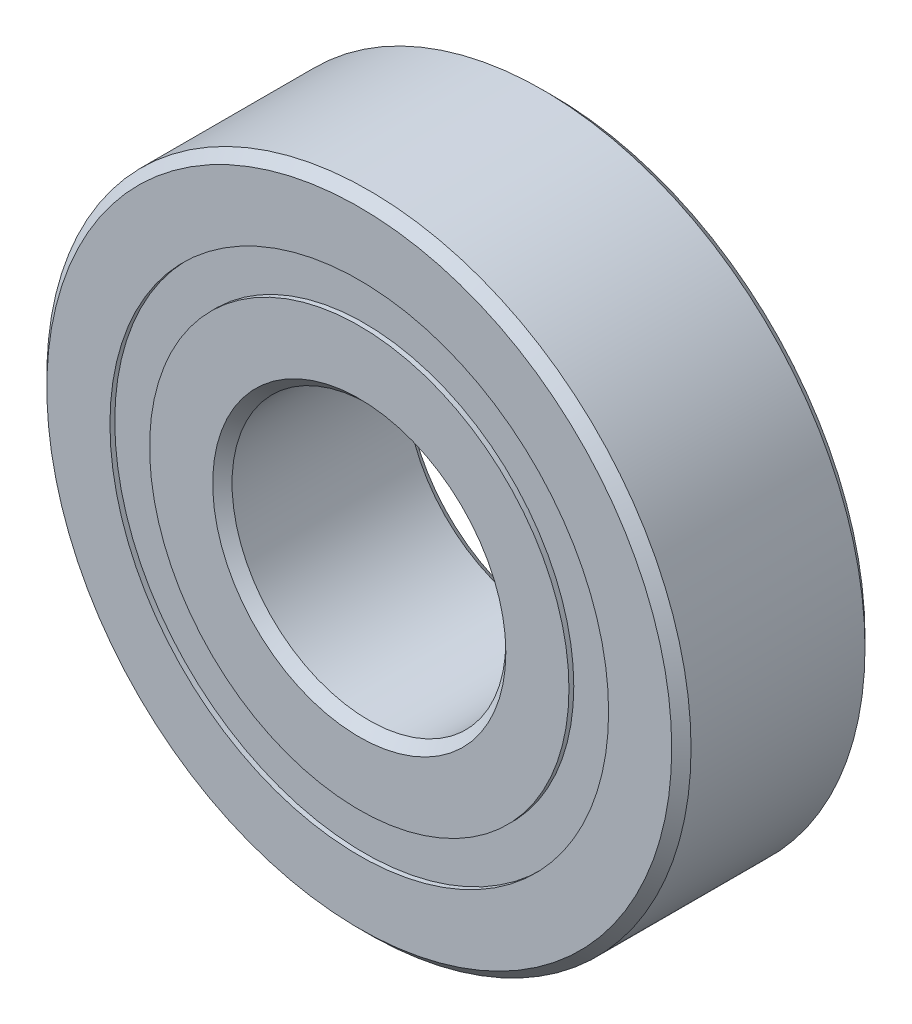
ISO-10303-21;
HEADER;
FILE_DESCRIPTION(('STEP AP214'),'2;1');
FILE_NAME('part.step','',(''),(''),'','','');
FILE_SCHEMA(('AUTOMOTIVE_DESIGN { 1 0 10303 214 1 1 1 1 }'));
ENDSEC;
DATA;
#1=APPLICATION_CONTEXT('core data for automotive mechanical design processes');
#2=APPLICATION_PROTOCOL_DEFINITION('international standard','automotive_design',2000,#1);
#3=PRODUCT_CONTEXT('',#1,'mechanical');
#4=PRODUCT('Part','Part','',(#3));
#5=PRODUCT_RELATED_PRODUCT_CATEGORY('part','',(#4));
#6=PRODUCT_DEFINITION_FORMATION('','',#4);
#7=PRODUCT_DEFINITION_CONTEXT('part definition',#1,'design');
#8=PRODUCT_DEFINITION('design','',#6,#7);
#9=PRODUCT_DEFINITION_SHAPE('','',#8);
#10=(LENGTH_UNIT() NAMED_UNIT(*) SI_UNIT(.MILLI.,.METRE.));
#11=(NAMED_UNIT(*) PLANE_ANGLE_UNIT() SI_UNIT($,.RADIAN.));
#12=(NAMED_UNIT(*) SI_UNIT($,.STERADIAN.) SOLID_ANGLE_UNIT());
#13=UNCERTAINTY_MEASURE_WITH_UNIT(LENGTH_MEASURE(1.E-05),#10,'distance_accuracy_value','');
#14=(GEOMETRIC_REPRESENTATION_CONTEXT(3) GLOBAL_UNCERTAINTY_ASSIGNED_CONTEXT((#13)) GLOBAL_UNIT_ASSIGNED_CONTEXT((#10,
#11,#12)) REPRESENTATION_CONTEXT('',''));
#15=CARTESIAN_POINT('',(0.,0.,0.));
#16=DIRECTION('',(0.,0.,1.));
#17=DIRECTION('',(1.,0.,0.));
#18=AXIS2_PLACEMENT_3D('',#15,#16,#17);
#19=CARTESIAN_POINT('',(0.,15.4807692307692,-5.7));
#20=DIRECTION('',(0.,0.,1.));
#21=DIRECTION('',(1.,0.,0.));
#22=AXIS2_PLACEMENT_3D('',#19,#20,#21);
#23=PLANE('',#22);
#24=CARTESIAN_POINT('',(0.,0.,-5.7));
#25=DIRECTION('',(0.,0.,1.));
#26=DIRECTION('',(1.,0.,0.));
#27=AXIS2_PLACEMENT_3D('',#24,#25,#26);
#28=CIRCLE('',#27,15.4807692307692);
#29=CARTESIAN_POINT('',(15.4807692307692,0.,-5.7));
#30=VERTEX_POINT('',#29);
#31=EDGE_CURVE('E60',#30,#30,#28,.T.);
#32=ORIENTED_EDGE('',*,*,#31,.F.);
#33=EDGE_LOOP('',(#32));
#34=FACE_BOUND('',#33,.T.);
#35=CARTESIAN_POINT('',(0.,0.,-5.7));
#36=DIRECTION('',(0.,0.,1.));
#37=DIRECTION('',(1.,0.,0.));
#38=AXIS2_PLACEMENT_3D('',#35,#36,#37);
#39=CIRCLE('',#38,13.0192307692308);
#40=CARTESIAN_POINT('',(13.0192307692308,0.,-5.7));
#41=VERTEX_POINT('',#40);
#42=EDGE_CURVE('E11',#41,#41,#39,.T.);
#43=ORIENTED_EDGE('',*,*,#42,.T.);
#44=EDGE_LOOP('',(#43));
#45=FACE_BOUND('',#44,.T.);
#46=ADVANCED_FACE('F46',(#34,#45),#23,.F.);
#47=CARTESIAN_POINT('',(0.,0.,6.));
#48=DIRECTION('',(0.,0.,1.));
#49=DIRECTION('',(1.,0.,0.));
#50=AXIS2_PLACEMENT_3D('',#47,#48,#49);
#51=CYLINDRICAL_SURFACE('',#50,13.0192307692308);
#52=ORIENTED_EDGE('',*,*,#42,.F.);
#53=EDGE_LOOP('',(#52));
#54=FACE_BOUND('',#53,.T.);
#55=CARTESIAN_POINT('',(0.,0.,-2.93698893605669));
#56=DIRECTION('',(0.,0.,1.));
#57=DIRECTION('',(1.,0.,0.));
#58=AXIS2_PLACEMENT_3D('',#55,#56,#57);
#59=CIRCLE('',#58,13.0192307692308);
#60=CARTESIAN_POINT('',(13.0192307692308,0.,-2.93698893605669));
#61=VERTEX_POINT('',#60);
#62=EDGE_CURVE('E52',#61,#61,#59,.T.);
#63=ORIENTED_EDGE('',*,*,#62,.T.);
#64=EDGE_LOOP('',(#63));
#65=FACE_BOUND('',#64,.T.);
#66=ADVANCED_FACE('F69',(#54,#65),#51,.F.);
#67=CARTESIAN_POINT('',(0.,15.4807692307692,-2.93698893605669));
#68=DIRECTION('',(0.,0.,-1.));
#69=DIRECTION('',(-1.,0.,0.));
#70=AXIS2_PLACEMENT_3D('',#67,#68,#69);
#71=PLANE('',#70);
#72=ORIENTED_EDGE('',*,*,#62,.F.);
#73=EDGE_LOOP('',(#72));
#74=FACE_BOUND('',#73,.T.);
#75=CARTESIAN_POINT('',(0.,0.,-2.93698893605669));
#76=DIRECTION('',(0.,0.,1.));
#77=DIRECTION('',(1.,0.,0.));
#78=AXIS2_PLACEMENT_3D('',#75,#76,#77);
#79=CIRCLE('',#78,15.4807692307692);
#80=CARTESIAN_POINT('',(15.4807692307692,0.,-2.93698893605669));
#81=VERTEX_POINT('',#80);
#82=EDGE_CURVE('E56',#81,#81,#79,.T.);
#83=ORIENTED_EDGE('',*,*,#82,.T.);
#84=EDGE_LOOP('',(#83));
#85=FACE_BOUND('',#84,.T.);
#86=ADVANCED_FACE('F73',(#74,#85),#71,.F.);
#87=CARTESIAN_POINT('',(0.,0.,6.));
#88=DIRECTION('',(0.,0.,1.));
#89=DIRECTION('',(1.,0.,0.));
#90=AXIS2_PLACEMENT_3D('',#87,#88,#89);
#91=CYLINDRICAL_SURFACE('',#90,15.4807692307692);
#92=ORIENTED_EDGE('',*,*,#82,.F.);
#93=EDGE_LOOP('',(#92));
#94=FACE_BOUND('',#93,.T.);
#95=ORIENTED_EDGE('',*,*,#31,.T.);
#96=EDGE_LOOP('',(#95));
#97=FACE_BOUND('',#96,.T.);
#98=ADVANCED_FACE('F66',(#94,#97),#91,.T.);
#99=CLOSED_SHELL('',(#46,#66,#86,#98));
#100=MANIFOLD_SOLID_BREP('B2',#99);
#101=CARTESIAN_POINT('',(0.,15.4807692307692,5.7));
#102=DIRECTION('',(0.,0.,-1.));
#103=DIRECTION('',(-1.,0.,0.));
#104=AXIS2_PLACEMENT_3D('',#101,#102,#103);
#105=PLANE('',#104);
#106=CARTESIAN_POINT('',(0.,0.,5.7));
#107=DIRECTION('',(0.,0.,1.));
#108=DIRECTION('',(1.,0.,0.));
#109=AXIS2_PLACEMENT_3D('',#106,#107,#108);
#110=CIRCLE('',#109,13.0192307692308);
#111=CARTESIAN_POINT('',(13.0192307692308,0.,5.7));
#112=VERTEX_POINT('',#111);
#113=EDGE_CURVE('E45',#112,#112,#110,.T.);
#114=ORIENTED_EDGE('',*,*,#113,.F.);
#115=EDGE_LOOP('',(#114));
#116=FACE_BOUND('',#115,.T.);
#117=CARTESIAN_POINT('',(0.,0.,5.7));
#118=DIRECTION('',(0.,0.,1.));
#119=DIRECTION('',(1.,0.,0.));
#120=AXIS2_PLACEMENT_3D('',#117,#118,#119);
#121=CIRCLE('',#120,15.4807692307692);
#122=CARTESIAN_POINT('',(15.4807692307692,0.,5.7));
#123=VERTEX_POINT('',#122);
#124=EDGE_CURVE('E128',#123,#123,#121,.T.);
#125=ORIENTED_EDGE('',*,*,#124,.T.);
#126=EDGE_LOOP('',(#125));
#127=FACE_BOUND('',#126,.T.);
#128=ADVANCED_FACE('F114',(#116,#127),#105,.F.);
#129=CARTESIAN_POINT('',(0.,0.,6.));
#130=DIRECTION('',(0.,0.,1.));
#131=DIRECTION('',(1.,0.,0.));
#132=AXIS2_PLACEMENT_3D('',#129,#130,#131);
#133=CYLINDRICAL_SURFACE('',#132,13.0192307692308);
#134=CARTESIAN_POINT('',(0.,0.,2.93698893605669));
#135=DIRECTION('',(0.,0.,1.));
#136=DIRECTION('',(1.,0.,0.));
#137=AXIS2_PLACEMENT_3D('',#134,#135,#136);
#138=CIRCLE('',#137,13.0192307692308);
#139=CARTESIAN_POINT('',(13.0192307692308,0.,2.93698893605669));
#140=VERTEX_POINT('',#139);
#141=EDGE_CURVE('E120',#140,#140,#138,.T.);
#142=ORIENTED_EDGE('',*,*,#141,.F.);
#143=EDGE_LOOP('',(#142));
#144=FACE_BOUND('',#143,.T.);
#145=ORIENTED_EDGE('',*,*,#113,.T.);
#146=EDGE_LOOP('',(#145));
#147=FACE_BOUND('',#146,.T.);
#148=ADVANCED_FACE('F143',(#144,#147),#133,.F.);
#149=CARTESIAN_POINT('',(0.,15.4807692307692,2.93698893605669));
#150=DIRECTION('',(0.,0.,1.));
#151=DIRECTION('',(1.,0.,0.));
#152=AXIS2_PLACEMENT_3D('',#149,#150,#151);
#153=PLANE('',#152);
#154=CARTESIAN_POINT('',(0.,0.,2.93698893605669));
#155=DIRECTION('',(0.,0.,1.));
#156=DIRECTION('',(1.,0.,0.));
#157=AXIS2_PLACEMENT_3D('',#154,#155,#156);
#158=CIRCLE('',#157,15.4807692307692);
#159=CARTESIAN_POINT('',(15.4807692307692,0.,2.93698893605669));
#160=VERTEX_POINT('',#159);
#161=EDGE_CURVE('E124',#160,#160,#158,.T.);
#162=ORIENTED_EDGE('',*,*,#161,.F.);
#163=EDGE_LOOP('',(#162));
#164=FACE_BOUND('',#163,.T.);
#165=ORIENTED_EDGE('',*,*,#141,.T.);
#166=EDGE_LOOP('',(#165));
#167=FACE_BOUND('',#166,.T.);
#168=ADVANCED_FACE('F138',(#164,#167),#153,.F.);
#169=CARTESIAN_POINT('',(0.,0.,6.));
#170=DIRECTION('',(0.,0.,1.));
#171=DIRECTION('',(1.,0.,0.));
#172=AXIS2_PLACEMENT_3D('',#169,#170,#171);
#173=CYLINDRICAL_SURFACE('',#172,15.4807692307692);
#174=ORIENTED_EDGE('',*,*,#124,.F.);
#175=EDGE_LOOP('',(#174));
#176=FACE_BOUND('',#175,.T.);
#177=ORIENTED_EDGE('',*,*,#161,.T.);
#178=EDGE_LOOP('',(#177));
#179=FACE_BOUND('',#178,.T.);
#180=ADVANCED_FACE('F135',(#176,#179),#173,.T.);
#181=CLOSED_SHELL('',(#128,#148,#168,#180));
#182=MANIFOLD_SOLID_BREP('B6',#181);
#183=CARTESIAN_POINT('',(-6.18284328242504,12.8388063676096,0.));
#184=DIRECTION('',(0.,0.,1.));
#185=DIRECTION('',(-0.433883739117546,0.900968867902425,0.));
#186=AXIS2_PLACEMENT_3D('',#183,#184,#185);
#187=SPHERICAL_SURFACE('',#186,2.93698893605669);
#188=CARTESIAN_POINT('',(-6.18284328242504,12.8388063676096,2.93698893605669));
#189=VERTEX_POINT('',#188);
#190=VERTEX_LOOP('',#189);
#191=FACE_BOUND('',#190,.T.);
#192=ADVANCED_FACE('F182',(#191),#187,.T.);
#193=CLOSED_SHELL('',(#192));
#194=MANIFOLD_SOLID_BREP('B40',#193);
#195=CARTESIAN_POINT('',(-11.1410986251693,8.88472967648709,0.));
#196=DIRECTION('',(0.,0.,1.));
#197=DIRECTION('',(-0.781831482468022,0.623489801858743,0.));
#198=AXIS2_PLACEMENT_3D('',#195,#196,#197);
#199=SPHERICAL_SURFACE('',#198,2.93698893605669);
#200=CARTESIAN_POINT('',(-11.1410986251693,8.88472967648709,2.93698893605669));
#201=VERTEX_POINT('',#200);
#202=VERTEX_LOOP('',#201);
#203=FACE_BOUND('',#202,.T.);
#204=ADVANCED_FACE('F203',(#203),#199,.T.);
#205=CLOSED_SHELL('',(#204));
#206=MANIFOLD_SOLID_BREP('B110',#205);
#207=CARTESIAN_POINT('',(-13.892722748591,3.17092330887763,0.));
#208=DIRECTION('',(0.,0.,1.));
#209=DIRECTION('',(-0.974927912181821,0.222520933956325,0.));
#210=AXIS2_PLACEMENT_3D('',#207,#208,#209);
#211=SPHERICAL_SURFACE('',#210,2.93698893605669);
#212=CARTESIAN_POINT('',(-13.892722748591,3.17092330887763,2.93698893605669));
#213=VERTEX_POINT('',#212);
#214=VERTEX_LOOP('',#213);
#215=FACE_BOUND('',#214,.T.);
#216=ADVANCED_FACE('F224',(#215),#211,.T.);
#217=CLOSED_SHELL('',(#216));
#218=MANIFOLD_SOLID_BREP('B178',#217);
#219=CARTESIAN_POINT('',(-13.892722748591,-3.17092330887735,0.));
#220=DIRECTION('',(0.,0.,1.));
#221=DIRECTION('',(-0.974927912181826,-0.222520933956305,0.));
#222=AXIS2_PLACEMENT_3D('',#219,#220,#221);
#223=SPHERICAL_SURFACE('',#222,2.93698893605669);
#224=CARTESIAN_POINT('',(-13.892722748591,-3.17092330887735,2.93698893605669));
#225=VERTEX_POINT('',#224);
#226=VERTEX_LOOP('',#225);
#227=FACE_BOUND('',#226,.T.);
#228=ADVANCED_FACE('F245',(#227),#223,.T.);
#229=CLOSED_SHELL('',(#228));
#230=MANIFOLD_SOLID_BREP('B199',#229);
#231=CARTESIAN_POINT('',(-11.1410986251695,-8.88472967648686,0.));
#232=DIRECTION('',(0.,0.,1.));
#233=DIRECTION('',(-0.781831482468035,-0.623489801858727,0.));
#234=AXIS2_PLACEMENT_3D('',#231,#232,#233);
#235=SPHERICAL_SURFACE('',#234,2.93698893605669);
#236=CARTESIAN_POINT('',(-11.1410986251695,-8.88472967648686,2.93698893605669));
#237=VERTEX_POINT('',#236);
#238=VERTEX_LOOP('',#237);
#239=FACE_BOUND('',#238,.T.);
#240=ADVANCED_FACE('F266',(#239),#235,.T.);
#241=CLOSED_SHELL('',(#240));
#242=MANIFOLD_SOLID_BREP('B220',#241);
#243=CARTESIAN_POINT('',(-6.1828432824253,-12.8388063676094,0.));
#244=DIRECTION('',(0.,0.,1.));
#245=DIRECTION('',(-0.433883739117565,-0.900968867902416,0.));
#246=AXIS2_PLACEMENT_3D('',#243,#244,#245);
#247=SPHERICAL_SURFACE('',#246,2.93698893605669);
#248=CARTESIAN_POINT('',(-6.1828432824253,-12.8388063676094,2.93698893605669));
#249=VERTEX_POINT('',#248);
#250=VERTEX_LOOP('',#249);
#251=FACE_BOUND('',#250,.T.);
#252=ADVANCED_FACE('F287',(#251),#247,.T.);
#253=CLOSED_SHELL('',(#252));
#254=MANIFOLD_SOLID_BREP('B241',#253);
#255=CARTESIAN_POINT('',(0.,-14.25,0.));
#256=DIRECTION('',(0.,0.,1.));
#257=DIRECTION('',(0.,-1.,0.));
#258=AXIS2_PLACEMENT_3D('',#255,#256,#257);
#259=SPHERICAL_SURFACE('',#258,2.93698893605669);
#260=CARTESIAN_POINT('',(0.,-14.25,2.93698893605669));
#261=VERTEX_POINT('',#260);
#262=VERTEX_LOOP('',#261);
#263=FACE_BOUND('',#262,.T.);
#264=ADVANCED_FACE('F308',(#263),#259,.T.);
#265=CLOSED_SHELL('',(#264));
#266=MANIFOLD_SOLID_BREP('B262',#265);
#267=CARTESIAN_POINT('',(6.18284328242513,-12.8388063676095,0.));
#268=DIRECTION('',(0.,0.,1.));
#269=DIRECTION('',(0.433883739117553,-0.900968867902422,0.));
#270=AXIS2_PLACEMENT_3D('',#267,#268,#269);
#271=SPHERICAL_SURFACE('',#270,2.93698893605669);
#272=CARTESIAN_POINT('',(6.18284328242513,-12.8388063676095,2.93698893605669));
#273=VERTEX_POINT('',#272);
#274=VERTEX_LOOP('',#273);
#275=FACE_BOUND('',#274,.T.);
#276=ADVANCED_FACE('F329',(#275),#271,.T.);
#277=CLOSED_SHELL('',(#276));
#278=MANIFOLD_SOLID_BREP('B283',#277);
#279=CARTESIAN_POINT('',(11.1410986251694,-8.88472967648701,0.));
#280=DIRECTION('',(0.,0.,1.));
#281=DIRECTION('',(0.781831482468027,-0.623489801858737,0.));
#282=AXIS2_PLACEMENT_3D('',#279,#280,#281);
#283=SPHERICAL_SURFACE('',#282,2.93698893605669);
#284=CARTESIAN_POINT('',(11.1410986251694,-8.88472967648701,2.93698893605669));
#285=VERTEX_POINT('',#284);
#286=VERTEX_LOOP('',#285);
#287=FACE_BOUND('',#286,.T.);
#288=ADVANCED_FACE('F350',(#287),#283,.T.);
#289=CLOSED_SHELL('',(#288));
#290=MANIFOLD_SOLID_BREP('B304',#289);
#291=CARTESIAN_POINT('',(13.892722748591,-3.17092330887753,0.));
#292=DIRECTION('',(0.,0.,1.));
#293=DIRECTION('',(0.974927912181823,-0.222520933956318,0.));
#294=AXIS2_PLACEMENT_3D('',#291,#292,#293);
#295=SPHERICAL_SURFACE('',#294,2.93698893605669);
#296=CARTESIAN_POINT('',(13.892722748591,-3.17092330887753,2.93698893605669));
#297=VERTEX_POINT('',#296);
#298=VERTEX_LOOP('',#297);
#299=FACE_BOUND('',#298,.T.);
#300=ADVANCED_FACE('F371',(#299),#295,.T.);
#301=CLOSED_SHELL('',(#300));
#302=MANIFOLD_SOLID_BREP('B325',#301);
#303=CARTESIAN_POINT('',(13.892722748591,3.17092330887744,0.));
#304=DIRECTION('',(0.,0.,1.));
#305=DIRECTION('',(0.974927912181824,0.222520933956311,0.));
#306=AXIS2_PLACEMENT_3D('',#303,#304,#305);
#307=SPHERICAL_SURFACE('',#306,2.93698893605669);
#308=CARTESIAN_POINT('',(13.892722748591,3.17092330887744,2.93698893605669));
#309=VERTEX_POINT('',#308);
#310=VERTEX_LOOP('',#309);
#311=FACE_BOUND('',#310,.T.);
#312=ADVANCED_FACE('F392',(#311),#307,.T.);
#313=CLOSED_SHELL('',(#312));
#314=MANIFOLD_SOLID_BREP('B346',#313);
#315=CARTESIAN_POINT('',(11.1410986251694,8.88472967648693,0.));
#316=DIRECTION('',(0.,0.,1.));
#317=DIRECTION('',(0.781831482468031,0.623489801858732,0.));
#318=AXIS2_PLACEMENT_3D('',#315,#316,#317);
#319=SPHERICAL_SURFACE('',#318,2.93698893605669);
#320=CARTESIAN_POINT('',(11.1410986251694,8.88472967648693,2.93698893605669));
#321=VERTEX_POINT('',#320);
#322=VERTEX_LOOP('',#321);
#323=FACE_BOUND('',#322,.T.);
#324=ADVANCED_FACE('F413',(#323),#319,.T.);
#325=CLOSED_SHELL('',(#324));
#326=MANIFOLD_SOLID_BREP('B367',#325);
#327=CARTESIAN_POINT('',(6.18284328242522,12.8388063676095,0.));
#328=DIRECTION('',(0.,0.,1.));
#329=DIRECTION('',(0.433883739117559,0.900968867902419,0.));
#330=AXIS2_PLACEMENT_3D('',#327,#328,#329);
#331=SPHERICAL_SURFACE('',#330,2.93698893605669);
#332=CARTESIAN_POINT('',(6.18284328242522,12.8388063676095,2.93698893605669));
#333=VERTEX_POINT('',#332);
#334=VERTEX_LOOP('',#333);
#335=FACE_BOUND('',#334,.T.);
#336=ADVANCED_FACE('F434',(#335),#331,.T.);
#337=CLOSED_SHELL('',(#336));
#338=MANIFOLD_SOLID_BREP('B388',#337);
#339=CARTESIAN_POINT('',(0.,14.25,0.));
#340=DIRECTION('',(0.,0.,1.));
#341=DIRECTION('',(0.,1.,0.));
#342=AXIS2_PLACEMENT_3D('',#339,#340,#341);
#343=SPHERICAL_SURFACE('',#342,2.93698893605669);
#344=CARTESIAN_POINT('',(0.,14.25,2.93698893605669));
#345=VERTEX_POINT('',#344);
#346=VERTEX_LOOP('',#345);
#347=FACE_BOUND('',#346,.T.);
#348=ADVANCED_FACE('F457',(#347),#343,.T.);
#349=CLOSED_SHELL('',(#348));
#350=MANIFOLD_SOLID_BREP('B409',#349);
#351=CARTESIAN_POINT('',(0.,13.0192307692308,6.));
#352=DIRECTION('',(0.,0.,-1.));
#353=DIRECTION('',(-1.,0.,0.));
#354=AXIS2_PLACEMENT_3D('',#351,#352,#353);
#355=PLANE('',#354);
#356=CARTESIAN_POINT('',(0.,0.,6.));
#357=DIRECTION('',(0.,0.,1.));
#358=DIRECTION('',(1.,0.,0.));
#359=AXIS2_PLACEMENT_3D('',#356,#357,#358);
#360=CIRCLE('',#359,9.1);
#361=CARTESIAN_POINT('',(9.1,0.,6.));
#362=VERTEX_POINT('',#361);
#363=EDGE_CURVE('E505',#362,#362,#360,.T.);
#364=ORIENTED_EDGE('',*,*,#363,.F.);
#365=EDGE_LOOP('',(#364));
#366=FACE_BOUND('',#365,.T.);
#367=CARTESIAN_POINT('',(0.,0.,6.));
#368=DIRECTION('',(0.,0.,1.));
#369=DIRECTION('',(1.,0.,0.));
#370=AXIS2_PLACEMENT_3D('',#367,#368,#369);
#371=CIRCLE('',#370,13.0192307692308);
#372=CARTESIAN_POINT('',(13.0192307692308,0.,6.));
#373=VERTEX_POINT('',#372);
#374=EDGE_CURVE('E456',#373,#373,#371,.T.);
#375=ORIENTED_EDGE('',*,*,#374,.T.);
#376=EDGE_LOOP('',(#375));
#377=FACE_BOUND('',#376,.T.);
#378=ADVANCED_FACE('F477',(#366,#377),#355,.F.);
#379=CARTESIAN_POINT('',(0.,0.,6.));
#380=DIRECTION('',(0.,0.,1.));
#381=DIRECTION('',(1.,0.,0.));
#382=AXIS2_PLACEMENT_3D('',#379,#380,#381);
#383=CYLINDRICAL_SURFACE('',#382,13.0192307692308);
#384=ORIENTED_EDGE('',*,*,#374,.F.);
#385=EDGE_LOOP('',(#384));
#386=FACE_BOUND('',#385,.T.);
#387=CARTESIAN_POINT('',(0.,0.,2.66666666666667));
#388=DIRECTION('',(0.,0.,1.));
#389=DIRECTION('',(1.,0.,0.));
#390=AXIS2_PLACEMENT_3D('',#387,#388,#389);
#391=CIRCLE('',#390,13.0192307692308);
#392=CARTESIAN_POINT('',(13.0192307692308,0.,2.66666666666667));
#393=VERTEX_POINT('',#392);
#394=EDGE_CURVE('E483',#393,#393,#391,.T.);
#395=ORIENTED_EDGE('',*,*,#394,.T.);
#396=EDGE_LOOP('',(#395));
#397=FACE_BOUND('',#396,.T.);
#398=ADVANCED_FACE('F512',(#386,#397),#383,.T.);
#399=CARTESIAN_POINT('',(0.,0.,0.));
#400=DIRECTION('',(0.,0.,1.));
#401=DIRECTION('',(1.,0.,0.));
#402=AXIS2_PLACEMENT_3D('',#399,#400,#401);
#403=TOROIDAL_SURFACE('',#402,14.25,2.93698893605668);
#404=ORIENTED_EDGE('',*,*,#394,.F.);
#405=EDGE_LOOP('',(#404));
#406=FACE_BOUND('',#405,.T.);
#407=CARTESIAN_POINT('',(0.,0.,-2.66666666666667));
#408=DIRECTION('',(0.,0.,1.));
#409=DIRECTION('',(1.,0.,0.));
#410=AXIS2_PLACEMENT_3D('',#407,#408,#409);
#411=CIRCLE('',#410,13.0192307692308);
#412=CARTESIAN_POINT('',(13.0192307692308,0.,-2.66666666666667));
#413=VERTEX_POINT('',#412);
#414=EDGE_CURVE('E487',#413,#413,#411,.T.);
#415=ORIENTED_EDGE('',*,*,#414,.T.);
#416=EDGE_LOOP('',(#415));
#417=FACE_BOUND('',#416,.T.);
#418=ADVANCED_FACE('F516',(#406,#417),#403,.F.);
#419=CARTESIAN_POINT('',(0.,0.,6.));
#420=DIRECTION('',(0.,0.,1.));
#421=DIRECTION('',(1.,0.,0.));
#422=AXIS2_PLACEMENT_3D('',#419,#420,#421);
#423=CYLINDRICAL_SURFACE('',#422,13.0192307692308);
#424=ORIENTED_EDGE('',*,*,#414,.F.);
#425=EDGE_LOOP('',(#424));
#426=FACE_BOUND('',#425,.T.);
#427=CARTESIAN_POINT('',(0.,0.,-6.));
#428=DIRECTION('',(0.,0.,1.));
#429=DIRECTION('',(1.,0.,0.));
#430=AXIS2_PLACEMENT_3D('',#427,#428,#429);
#431=CIRCLE('',#430,13.0192307692308);
#432=CARTESIAN_POINT('',(13.0192307692308,0.,-6.));
#433=VERTEX_POINT('',#432);
#434=EDGE_CURVE('E491',#433,#433,#431,.T.);
#435=ORIENTED_EDGE('',*,*,#434,.T.);
#436=EDGE_LOOP('',(#435));
#437=FACE_BOUND('',#436,.T.);
#438=ADVANCED_FACE('F521',(#426,#437),#423,.T.);
#439=CARTESIAN_POINT('',(0.,9.1,-6.));
#440=DIRECTION('',(0.,0.,1.));
#441=DIRECTION('',(1.,0.,0.));
#442=AXIS2_PLACEMENT_3D('',#439,#440,#441);
#443=PLANE('',#442);
#444=ORIENTED_EDGE('',*,*,#434,.F.);
#445=EDGE_LOOP('',(#444));
#446=FACE_BOUND('',#445,.T.);
#447=CARTESIAN_POINT('',(0.,0.,-6.));
#448=DIRECTION('',(0.,0.,1.));
#449=DIRECTION('',(1.,0.,0.));
#450=AXIS2_PLACEMENT_3D('',#447,#448,#449);
#451=CIRCLE('',#450,9.1);
#452=CARTESIAN_POINT('',(9.1,0.,-6.));
#453=VERTEX_POINT('',#452);
#454=EDGE_CURVE('E496',#453,#453,#451,.T.);
#455=ORIENTED_EDGE('',*,*,#454,.T.);
#456=EDGE_LOOP('',(#455));
#457=FACE_BOUND('',#456,.T.);
#458=ADVANCED_FACE('F527',(#446,#457),#443,.F.);
#459=CARTESIAN_POINT('',(0.,0.,-5.4));
#460=DIRECTION('',(0.,0.,-1.));
#461=DIRECTION('',(-1.,0.,0.));
#462=AXIS2_PLACEMENT_3D('',#459,#460,#461);
#463=CONICAL_SURFACE('',#462,8.5,0.785398163397445);
#464=ORIENTED_EDGE('',*,*,#454,.F.);
#465=EDGE_LOOP('',(#464));
#466=FACE_BOUND('',#465,.T.);
#467=CARTESIAN_POINT('',(0.,0.,-5.4));
#468=DIRECTION('',(0.,0.,1.));
#469=DIRECTION('',(1.,0.,0.));
#470=AXIS2_PLACEMENT_3D('',#467,#468,#469);
#471=CIRCLE('',#470,8.5);
#472=CARTESIAN_POINT('',(8.5,0.,-5.4));
#473=VERTEX_POINT('',#472);
#474=EDGE_CURVE('E499',#473,#473,#471,.T.);
#475=ORIENTED_EDGE('',*,*,#474,.T.);
#476=EDGE_LOOP('',(#475));
#477=FACE_BOUND('',#476,.T.);
#478=ADVANCED_FACE('F531',(#466,#477),#463,.F.);
#479=CARTESIAN_POINT('',(0.,0.,6.));
#480=DIRECTION('',(0.,0.,1.));
#481=DIRECTION('',(1.,0.,0.));
#482=AXIS2_PLACEMENT_3D('',#479,#480,#481);
#483=CYLINDRICAL_SURFACE('',#482,8.5);
#484=ORIENTED_EDGE('',*,*,#474,.F.);
#485=EDGE_LOOP('',(#484));
#486=FACE_BOUND('',#485,.T.);
#487=CARTESIAN_POINT('',(0.,0.,5.4));
#488=DIRECTION('',(0.,0.,1.));
#489=DIRECTION('',(1.,0.,0.));
#490=AXIS2_PLACEMENT_3D('',#487,#488,#489);
#491=CIRCLE('',#490,8.5);
#492=CARTESIAN_POINT('',(8.5,0.,5.4));
#493=VERTEX_POINT('',#492);
#494=EDGE_CURVE('E502',#493,#493,#491,.T.);
#495=ORIENTED_EDGE('',*,*,#494,.T.);
#496=EDGE_LOOP('',(#495));
#497=FACE_BOUND('',#496,.T.);
#498=ADVANCED_FACE('F535',(#486,#497),#483,.F.);
#499=CARTESIAN_POINT('',(0.,0.,6.));
#500=DIRECTION('',(0.,0.,1.));
#501=DIRECTION('',(1.,0.,0.));
#502=AXIS2_PLACEMENT_3D('',#499,#500,#501);
#503=CONICAL_SURFACE('',#502,9.1,0.78539816339745);
#504=ORIENTED_EDGE('',*,*,#494,.F.);
#505=EDGE_LOOP('',(#504));
#506=FACE_BOUND('',#505,.T.);
#507=ORIENTED_EDGE('',*,*,#363,.T.);
#508=EDGE_LOOP('',(#507));
#509=FACE_BOUND('',#508,.T.);
#510=ADVANCED_FACE('F509',(#506,#509),#503,.F.);
#511=CLOSED_SHELL('',(#378,#398,#418,#438,#458,#478,#498,#510));
#512=MANIFOLD_SOLID_BREP('B430',#511);
#513=CARTESIAN_POINT('',(0.,0.,5.4));
#514=DIRECTION('',(0.,0.,-1.));
#515=DIRECTION('',(-1.,0.,0.));
#516=AXIS2_PLACEMENT_3D('',#513,#514,#515);
#517=CONICAL_SURFACE('',#516,20.,0.785398163397445);
#518=CARTESIAN_POINT('',(0.,0.,6.));
#519=DIRECTION('',(0.,0.,1.));
#520=DIRECTION('',(1.,0.,0.));
#521=AXIS2_PLACEMENT_3D('',#518,#519,#520);
#522=CIRCLE('',#521,19.4);
#523=CARTESIAN_POINT('',(19.4,0.,6.));
#524=VERTEX_POINT('',#523);
#525=EDGE_CURVE('E627',#524,#524,#522,.T.);
#526=ORIENTED_EDGE('',*,*,#525,.F.);
#527=EDGE_LOOP('',(#526));
#528=FACE_BOUND('',#527,.T.);
#529=CARTESIAN_POINT('',(0.,0.,5.4));
#530=DIRECTION('',(0.,0.,1.));
#531=DIRECTION('',(1.,0.,0.));
#532=AXIS2_PLACEMENT_3D('',#529,#530,#531);
#533=CIRCLE('',#532,20.);
#534=CARTESIAN_POINT('',(20.,0.,5.4));
#535=VERTEX_POINT('',#534);
#536=EDGE_CURVE('E476',#535,#535,#533,.T.);
#537=ORIENTED_EDGE('',*,*,#536,.T.);
#538=EDGE_LOOP('',(#537));
#539=FACE_BOUND('',#538,.T.);
#540=ADVANCED_FACE('F599',(#528,#539),#517,.T.);
#541=CARTESIAN_POINT('',(0.,0.,6.));
#542=DIRECTION('',(0.,0.,1.));
#543=DIRECTION('',(1.,0.,0.));
#544=AXIS2_PLACEMENT_3D('',#541,#542,#543);
#545=CYLINDRICAL_SURFACE('',#544,20.);
#546=ORIENTED_EDGE('',*,*,#536,.F.);
#547=EDGE_LOOP('',(#546));
#548=FACE_BOUND('',#547,.T.);
#549=CARTESIAN_POINT('',(0.,0.,-5.4));
#550=DIRECTION('',(0.,0.,1.));
#551=DIRECTION('',(1.,0.,0.));
#552=AXIS2_PLACEMENT_3D('',#549,#550,#551);
#553=CIRCLE('',#552,20.);
#554=CARTESIAN_POINT('',(20.,0.,-5.4));
#555=VERTEX_POINT('',#554);
#556=EDGE_CURVE('E605',#555,#555,#553,.T.);
#557=ORIENTED_EDGE('',*,*,#556,.T.);
#558=EDGE_LOOP('',(#557));
#559=FACE_BOUND('',#558,.T.);
#560=ADVANCED_FACE('F634',(#548,#559),#545,.T.);
#561=CARTESIAN_POINT('',(0.,0.,-6.));
#562=DIRECTION('',(0.,0.,1.));
#563=DIRECTION('',(1.,0.,0.));
#564=AXIS2_PLACEMENT_3D('',#561,#562,#563);
#565=CONICAL_SURFACE('',#564,19.4,0.785398163397445);
#566=ORIENTED_EDGE('',*,*,#556,.F.);
#567=EDGE_LOOP('',(#566));
#568=FACE_BOUND('',#567,.T.);
#569=CARTESIAN_POINT('',(0.,0.,-6.));
#570=DIRECTION('',(0.,0.,1.));
#571=DIRECTION('',(1.,0.,0.));
#572=AXIS2_PLACEMENT_3D('',#569,#570,#571);
#573=CIRCLE('',#572,19.4);
#574=CARTESIAN_POINT('',(19.4,0.,-6.));
#575=VERTEX_POINT('',#574);
#576=EDGE_CURVE('E609',#575,#575,#573,.T.);
#577=ORIENTED_EDGE('',*,*,#576,.T.);
#578=EDGE_LOOP('',(#577));
#579=FACE_BOUND('',#578,.T.);
#580=ADVANCED_FACE('F638',(#568,#579),#565,.T.);
#581=CARTESIAN_POINT('',(0.,19.4,-6.));
#582=DIRECTION('',(0.,0.,1.));
#583=DIRECTION('',(1.,0.,0.));
#584=AXIS2_PLACEMENT_3D('',#581,#582,#583);
#585=PLANE('',#584);
#586=ORIENTED_EDGE('',*,*,#576,.F.);
#587=EDGE_LOOP('',(#586));
#588=FACE_BOUND('',#587,.T.);
#589=CARTESIAN_POINT('',(0.,0.,-6.));
#590=DIRECTION('',(0.,0.,1.));
#591=DIRECTION('',(1.,0.,0.));
#592=AXIS2_PLACEMENT_3D('',#589,#590,#591);
#593=CIRCLE('',#592,15.4807692307692);
#594=CARTESIAN_POINT('',(15.4807692307692,0.,-6.));
#595=VERTEX_POINT('',#594);
#596=EDGE_CURVE('E613',#595,#595,#593,.T.);
#597=ORIENTED_EDGE('',*,*,#596,.T.);
#598=EDGE_LOOP('',(#597));
#599=FACE_BOUND('',#598,.T.);
#600=ADVANCED_FACE('F643',(#588,#599),#585,.F.);
#601=CARTESIAN_POINT('',(0.,0.,6.));
#602=DIRECTION('',(0.,0.,1.));
#603=DIRECTION('',(1.,0.,0.));
#604=AXIS2_PLACEMENT_3D('',#601,#602,#603);
#605=CYLINDRICAL_SURFACE('',#604,15.4807692307692);
#606=ORIENTED_EDGE('',*,*,#596,.F.);
#607=EDGE_LOOP('',(#606));
#608=FACE_BOUND('',#607,.T.);
#609=CARTESIAN_POINT('',(0.,0.,-2.66666666666667));
#610=DIRECTION('',(0.,0.,1.));
#611=DIRECTION('',(1.,0.,0.));
#612=AXIS2_PLACEMENT_3D('',#609,#610,#611);
#613=CIRCLE('',#612,15.4807692307692);
#614=CARTESIAN_POINT('',(15.4807692307692,0.,-2.66666666666667));
#615=VERTEX_POINT('',#614);
#616=EDGE_CURVE('E618',#615,#615,#613,.T.);
#617=ORIENTED_EDGE('',*,*,#616,.T.);
#618=EDGE_LOOP('',(#617));
#619=FACE_BOUND('',#618,.T.);
#620=ADVANCED_FACE('F649',(#608,#619),#605,.F.);
#621=CARTESIAN_POINT('',(0.,0.,0.));
#622=DIRECTION('',(0.,0.,1.));
#623=DIRECTION('',(1.,0.,0.));
#624=AXIS2_PLACEMENT_3D('',#621,#622,#623);
#625=TOROIDAL_SURFACE('',#624,14.25,2.93698893605669);
#626=ORIENTED_EDGE('',*,*,#616,.F.);
#627=EDGE_LOOP('',(#626));
#628=FACE_BOUND('',#627,.T.);
#629=CARTESIAN_POINT('',(0.,0.,2.66666666666667));
#630=DIRECTION('',(0.,0.,1.));
#631=DIRECTION('',(1.,0.,0.));
#632=AXIS2_PLACEMENT_3D('',#629,#630,#631);
#633=CIRCLE('',#632,15.4807692307692);
#634=CARTESIAN_POINT('',(15.4807692307692,0.,2.66666666666667));
#635=VERTEX_POINT('',#634);
#636=EDGE_CURVE('E621',#635,#635,#633,.T.);
#637=ORIENTED_EDGE('',*,*,#636,.T.);
#638=EDGE_LOOP('',(#637));
#639=FACE_BOUND('',#638,.T.);
#640=ADVANCED_FACE('F653',(#628,#639),#625,.F.);
#641=CARTESIAN_POINT('',(0.,0.,6.));
#642=DIRECTION('',(0.,0.,1.));
#643=DIRECTION('',(1.,0.,0.));
#644=AXIS2_PLACEMENT_3D('',#641,#642,#643);
#645=CYLINDRICAL_SURFACE('',#644,15.4807692307692);
#646=ORIENTED_EDGE('',*,*,#636,.F.);
#647=EDGE_LOOP('',(#646));
#648=FACE_BOUND('',#647,.T.);
#649=CARTESIAN_POINT('',(0.,0.,6.));
#650=DIRECTION('',(0.,0.,1.));
#651=DIRECTION('',(1.,0.,0.));
#652=AXIS2_PLACEMENT_3D('',#649,#650,#651);
#653=CIRCLE('',#652,15.4807692307692);
#654=CARTESIAN_POINT('',(15.4807692307692,0.,6.));
#655=VERTEX_POINT('',#654);
#656=EDGE_CURVE('E624',#655,#655,#653,.T.);
#657=ORIENTED_EDGE('',*,*,#656,.T.);
#658=EDGE_LOOP('',(#657));
#659=FACE_BOUND('',#658,.T.);
#660=ADVANCED_FACE('F657',(#648,#659),#645,.F.);
#661=CARTESIAN_POINT('',(0.,19.4,6.));
#662=DIRECTION('',(0.,0.,-1.));
#663=DIRECTION('',(-1.,0.,0.));
#664=AXIS2_PLACEMENT_3D('',#661,#662,#663);
#665=PLANE('',#664);
#666=ORIENTED_EDGE('',*,*,#656,.F.);
#667=EDGE_LOOP('',(#666));
#668=FACE_BOUND('',#667,.T.);
#669=ORIENTED_EDGE('',*,*,#525,.T.);
#670=EDGE_LOOP('',(#669));
#671=FACE_BOUND('',#670,.T.);
#672=ADVANCED_FACE('F631',(#668,#671),#665,.F.);
#673=CLOSED_SHELL('',(#540,#560,#580,#600,#620,#640,#660,#672));
#674=MANIFOLD_SOLID_BREP('B451',#673);
#675=ADVANCED_BREP_SHAPE_REPRESENTATION('',(#18,#100,#182,#194,#206,#218,#230,#242,#254,#266,
#278,#290,#302,#314,#326,#338,#350,#512,#674),#14);
#676=SHAPE_DEFINITION_REPRESENTATION(#9,#675);
ENDSEC;
END-ISO-10303-21;
